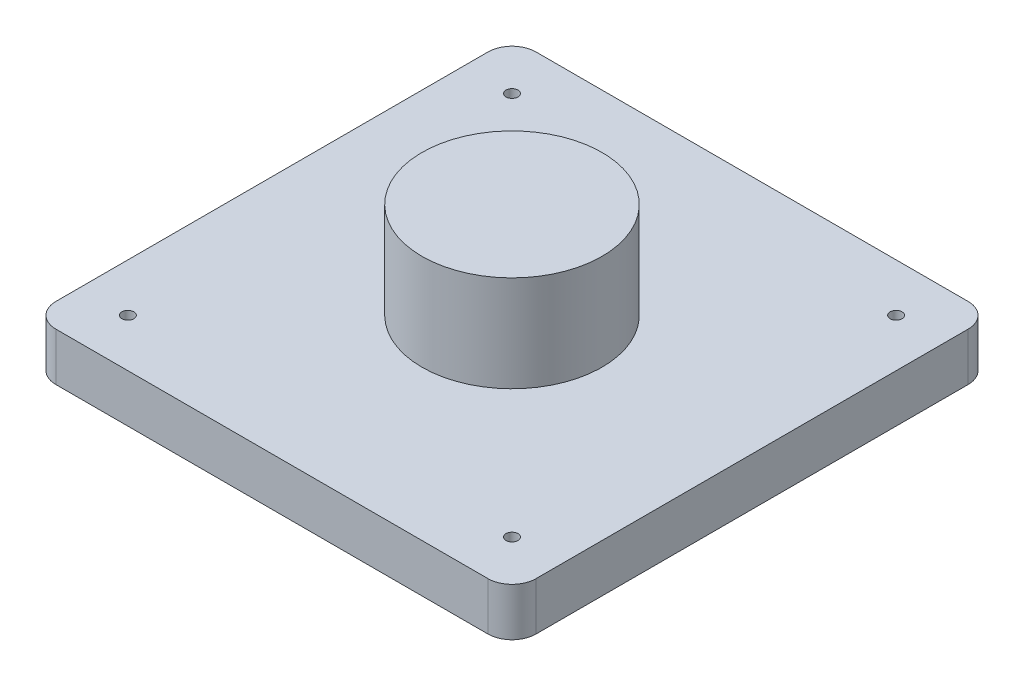
ISO-10303-21;
HEADER;
FILE_DESCRIPTION(('STEP AP214'),'2;1');
FILE_NAME('part.step','',(''),(''),'','','');
FILE_SCHEMA(('AUTOMOTIVE_DESIGN { 1 0 10303 214 1 1 1 1 }'));
ENDSEC;
DATA;
#1=APPLICATION_CONTEXT('core data for automotive mechanical design processes');
#2=APPLICATION_PROTOCOL_DEFINITION('international standard','automotive_design',2000,#1);
#3=PRODUCT_CONTEXT('',#1,'mechanical');
#4=PRODUCT('Part','Part','',(#3));
#5=PRODUCT_RELATED_PRODUCT_CATEGORY('part','',(#4));
#6=PRODUCT_DEFINITION_FORMATION('','',#4);
#7=PRODUCT_DEFINITION_CONTEXT('part definition',#1,'design');
#8=PRODUCT_DEFINITION('design','',#6,#7);
#9=PRODUCT_DEFINITION_SHAPE('','',#8);
#10=(LENGTH_UNIT() NAMED_UNIT(*) SI_UNIT(.MILLI.,.METRE.));
#11=(NAMED_UNIT(*) PLANE_ANGLE_UNIT() SI_UNIT($,.RADIAN.));
#12=(NAMED_UNIT(*) SI_UNIT($,.STERADIAN.) SOLID_ANGLE_UNIT());
#13=UNCERTAINTY_MEASURE_WITH_UNIT(LENGTH_MEASURE(1.E-05),#10,'distance_accuracy_value','');
#14=(GEOMETRIC_REPRESENTATION_CONTEXT(3) GLOBAL_UNCERTAINTY_ASSIGNED_CONTEXT((#13)) GLOBAL_UNIT_ASSIGNED_CONTEXT((#10,
#11,#12)) REPRESENTATION_CONTEXT('',''));
#15=CARTESIAN_POINT('',(0.,0.,0.));
#16=DIRECTION('',(0.,0.,1.));
#17=DIRECTION('',(1.,0.,0.));
#18=AXIS2_PLACEMENT_3D('',#15,#16,#17);
#19=CARTESIAN_POINT('',(-90.,20.,90.));
#20=DIRECTION('',(0.,-1.,0.));
#21=DIRECTION('',(0.,0.,-1.));
#22=AXIS2_PLACEMENT_3D('',#19,#20,#21);
#23=CYLINDRICAL_SURFACE('',#22,9.99999999999999);
#24=CARTESIAN_POINT('',(-90.,0.,90.));
#25=DIRECTION('',(0.,1.,0.));
#26=DIRECTION('',(0.,0.,-1.));
#27=AXIS2_PLACEMENT_3D('',#24,#25,#26);
#28=CIRCLE('',#27,9.99999999999999);
#29=CARTESIAN_POINT('',(-100.,0.,90.));
#30=VERTEX_POINT('',#29);
#31=CARTESIAN_POINT('',(-90.,0.,100.));
#32=VERTEX_POINT('',#31);
#33=EDGE_CURVE('E146',#30,#32,#28,.T.);
#34=ORIENTED_EDGE('',*,*,#33,.T.);
#35=DIRECTION('',(0.,-1.,0.));
#36=VECTOR('',#35,1.);
#37=CARTESIAN_POINT('',(-90.,20.,100.));
#38=LINE('',#37,#36);
#39=CARTESIAN_POINT('',(-90.,20.,100.));
#40=VERTEX_POINT('',#39);
#41=EDGE_CURVE('E46',#40,#32,#38,.T.);
#42=ORIENTED_EDGE('',*,*,#41,.F.);
#43=CARTESIAN_POINT('',(-90.,20.,90.));
#44=DIRECTION('',(0.,1.,0.));
#45=DIRECTION('',(0.,0.,-1.));
#46=AXIS2_PLACEMENT_3D('',#43,#44,#45);
#47=CIRCLE('',#46,9.99999999999999);
#48=CARTESIAN_POINT('',(-100.,20.,90.));
#49=VERTEX_POINT('',#48);
#50=EDGE_CURVE('E169',#49,#40,#47,.T.);
#51=ORIENTED_EDGE('',*,*,#50,.F.);
#52=DIRECTION('',(0.,-1.,0.));
#53=VECTOR('',#52,1.);
#54=CARTESIAN_POINT('',(-100.,20.,90.));
#55=LINE('',#54,#53);
#56=EDGE_CURVE('E142',#49,#30,#55,.T.);
#57=ORIENTED_EDGE('',*,*,#56,.T.);
#58=EDGE_LOOP('',(#34,#42,#51,#57));
#59=FACE_BOUND('',#58,.T.);
#60=ADVANCED_FACE('F43',(#59),#23,.T.);
#61=CARTESIAN_POINT('',(-90.,20.,100.));
#62=DIRECTION('',(0.,0.,-1.));
#63=DIRECTION('',(-1.,0.,0.));
#64=AXIS2_PLACEMENT_3D('',#61,#62,#63);
#65=PLANE('',#64);
#66=DIRECTION('',(1.,0.,0.));
#67=VECTOR('',#66,1.);
#68=CARTESIAN_POINT('',(-90.,0.,100.));
#69=LINE('',#68,#67);
#70=CARTESIAN_POINT('',(90.,0.,100.));
#71=VERTEX_POINT('',#70);
#72=EDGE_CURVE('E150',#32,#71,#69,.T.);
#73=ORIENTED_EDGE('',*,*,#72,.T.);
#74=DIRECTION('',(0.,-1.,0.));
#75=VECTOR('',#74,1.);
#76=CARTESIAN_POINT('',(90.,20.,100.));
#77=LINE('',#76,#75);
#78=CARTESIAN_POINT('',(90.,20.,100.));
#79=VERTEX_POINT('',#78);
#80=EDGE_CURVE('E183',#79,#71,#77,.T.);
#81=ORIENTED_EDGE('',*,*,#80,.F.);
#82=DIRECTION('',(1.,0.,0.));
#83=VECTOR('',#82,1.);
#84=CARTESIAN_POINT('',(-90.,20.,100.));
#85=LINE('',#84,#83);
#86=EDGE_CURVE('E105',#40,#79,#85,.T.);
#87=ORIENTED_EDGE('',*,*,#86,.F.);
#88=ORIENTED_EDGE('',*,*,#41,.T.);
#89=EDGE_LOOP('',(#73,#81,#87,#88));
#90=FACE_BOUND('',#89,.T.);
#91=ADVANCED_FACE('F191',(#90),#65,.F.);
#92=CARTESIAN_POINT('',(90.,20.,90.));
#93=DIRECTION('',(0.,-1.,0.));
#94=DIRECTION('',(0.,0.,-1.));
#95=AXIS2_PLACEMENT_3D('',#92,#93,#94);
#96=CYLINDRICAL_SURFACE('',#95,10.);
#97=CARTESIAN_POINT('',(90.,0.,90.));
#98=DIRECTION('',(0.,1.,0.));
#99=DIRECTION('',(0.,0.,1.));
#100=AXIS2_PLACEMENT_3D('',#97,#98,#99);
#101=CIRCLE('',#100,10.);
#102=CARTESIAN_POINT('',(100.,0.,90.));
#103=VERTEX_POINT('',#102);
#104=EDGE_CURVE('E154',#71,#103,#101,.T.);
#105=ORIENTED_EDGE('',*,*,#104,.T.);
#106=DIRECTION('',(0.,-1.,0.));
#107=VECTOR('',#106,1.);
#108=CARTESIAN_POINT('',(100.,20.,90.));
#109=LINE('',#108,#107);
#110=CARTESIAN_POINT('',(100.,20.,90.));
#111=VERTEX_POINT('',#110);
#112=EDGE_CURVE('E180',#111,#103,#109,.T.);
#113=ORIENTED_EDGE('',*,*,#112,.F.);
#114=CARTESIAN_POINT('',(90.,20.,90.));
#115=DIRECTION('',(0.,1.,0.));
#116=DIRECTION('',(0.,0.,1.));
#117=AXIS2_PLACEMENT_3D('',#114,#115,#116);
#118=CIRCLE('',#117,10.);
#119=EDGE_CURVE('E207',#79,#111,#118,.T.);
#120=ORIENTED_EDGE('',*,*,#119,.F.);
#121=ORIENTED_EDGE('',*,*,#80,.T.);
#122=EDGE_LOOP('',(#105,#113,#120,#121));
#123=FACE_BOUND('',#122,.T.);
#124=ADVANCED_FACE('F200',(#123),#96,.T.);
#125=CARTESIAN_POINT('',(100.,20.,90.));
#126=DIRECTION('',(-1.,0.,0.));
#127=DIRECTION('',(0.,0.,1.));
#128=AXIS2_PLACEMENT_3D('',#125,#126,#127);
#129=PLANE('',#128);
#130=DIRECTION('',(0.,0.,-1.));
#131=VECTOR('',#130,1.);
#132=CARTESIAN_POINT('',(100.,0.,90.));
#133=LINE('',#132,#131);
#134=CARTESIAN_POINT('',(100.,0.,-90.));
#135=VERTEX_POINT('',#134);
#136=EDGE_CURVE('E157',#103,#135,#133,.T.);
#137=ORIENTED_EDGE('',*,*,#136,.T.);
#138=DIRECTION('',(0.,-1.,0.));
#139=VECTOR('',#138,1.);
#140=CARTESIAN_POINT('',(100.,20.,-90.));
#141=LINE('',#140,#139);
#142=CARTESIAN_POINT('',(100.,20.,-90.));
#143=VERTEX_POINT('',#142);
#144=EDGE_CURVE('E176',#143,#135,#141,.T.);
#145=ORIENTED_EDGE('',*,*,#144,.F.);
#146=DIRECTION('',(0.,0.,-1.));
#147=VECTOR('',#146,1.);
#148=CARTESIAN_POINT('',(100.,20.,90.));
#149=LINE('',#148,#147);
#150=EDGE_CURVE('E205',#111,#143,#149,.T.);
#151=ORIENTED_EDGE('',*,*,#150,.F.);
#152=ORIENTED_EDGE('',*,*,#112,.T.);
#153=EDGE_LOOP('',(#137,#145,#151,#152));
#154=FACE_BOUND('',#153,.T.);
#155=ADVANCED_FACE('F203',(#154),#129,.F.);
#156=CARTESIAN_POINT('',(90.,20.,-90.));
#157=DIRECTION('',(0.,-1.,0.));
#158=DIRECTION('',(0.,0.,-1.));
#159=AXIS2_PLACEMENT_3D('',#156,#157,#158);
#160=CYLINDRICAL_SURFACE('',#159,10.);
#161=CARTESIAN_POINT('',(90.,0.,-90.));
#162=DIRECTION('',(0.,1.,0.));
#163=DIRECTION('',(0.,0.,-1.));
#164=AXIS2_PLACEMENT_3D('',#161,#162,#163);
#165=CIRCLE('',#164,10.);
#166=CARTESIAN_POINT('',(90.,0.,-100.));
#167=VERTEX_POINT('',#166);
#168=EDGE_CURVE('E160',#135,#167,#165,.T.);
#169=ORIENTED_EDGE('',*,*,#168,.T.);
#170=DIRECTION('',(0.,-1.,0.));
#171=VECTOR('',#170,1.);
#172=CARTESIAN_POINT('',(90.,20.,-100.));
#173=LINE('',#172,#171);
#174=CARTESIAN_POINT('',(90.,20.,-100.));
#175=VERTEX_POINT('',#174);
#176=EDGE_CURVE('E135',#175,#167,#173,.T.);
#177=ORIENTED_EDGE('',*,*,#176,.F.);
#178=CARTESIAN_POINT('',(90.,20.,-90.));
#179=DIRECTION('',(0.,1.,0.));
#180=DIRECTION('',(0.,0.,-1.));
#181=AXIS2_PLACEMENT_3D('',#178,#179,#180);
#182=CIRCLE('',#181,10.);
#183=EDGE_CURVE('E124',#143,#175,#182,.T.);
#184=ORIENTED_EDGE('',*,*,#183,.F.);
#185=ORIENTED_EDGE('',*,*,#144,.T.);
#186=EDGE_LOOP('',(#169,#177,#184,#185));
#187=FACE_BOUND('',#186,.T.);
#188=ADVANCED_FACE('F297',(#187),#160,.T.);
#189=CARTESIAN_POINT('',(-90.,20.,-100.));
#190=DIRECTION('',(0.,0.,1.));
#191=DIRECTION('',(1.,0.,0.));
#192=AXIS2_PLACEMENT_3D('',#189,#190,#191);
#193=PLANE('',#192);
#194=DIRECTION('',(-1.,0.,0.));
#195=VECTOR('',#194,1.);
#196=CARTESIAN_POINT('',(-90.,0.,-100.));
#197=LINE('',#196,#195);
#198=CARTESIAN_POINT('',(-90.,0.,-100.));
#199=VERTEX_POINT('',#198);
#200=EDGE_CURVE('E133',#167,#199,#197,.T.);
#201=ORIENTED_EDGE('',*,*,#200,.T.);
#202=DIRECTION('',(0.,-1.,0.));
#203=VECTOR('',#202,1.);
#204=CARTESIAN_POINT('',(-90.,20.,-100.));
#205=LINE('',#204,#203);
#206=CARTESIAN_POINT('',(-90.,20.,-100.));
#207=VERTEX_POINT('',#206);
#208=EDGE_CURVE('E130',#207,#199,#205,.T.);
#209=ORIENTED_EDGE('',*,*,#208,.F.);
#210=DIRECTION('',(-1.,0.,0.));
#211=VECTOR('',#210,1.);
#212=CARTESIAN_POINT('',(-90.,20.,-100.));
#213=LINE('',#212,#211);
#214=EDGE_CURVE('E118',#175,#207,#213,.T.);
#215=ORIENTED_EDGE('',*,*,#214,.F.);
#216=ORIENTED_EDGE('',*,*,#176,.T.);
#217=EDGE_LOOP('',(#201,#209,#215,#216));
#218=FACE_BOUND('',#217,.T.);
#219=ADVANCED_FACE('F131',(#218),#193,.F.);
#220=CARTESIAN_POINT('',(-90.,20.,-90.));
#221=DIRECTION('',(0.,-1.,0.));
#222=DIRECTION('',(0.,0.,-1.));
#223=AXIS2_PLACEMENT_3D('',#220,#221,#222);
#224=CYLINDRICAL_SURFACE('',#223,9.99999999999999);
#225=CARTESIAN_POINT('',(-90.,0.,-90.));
#226=DIRECTION('',(0.,1.,0.));
#227=DIRECTION('',(0.,0.,-1.));
#228=AXIS2_PLACEMENT_3D('',#225,#226,#227);
#229=CIRCLE('',#228,9.99999999999999);
#230=CARTESIAN_POINT('',(-100.,0.,-90.));
#231=VERTEX_POINT('',#230);
#232=EDGE_CURVE('E90',#199,#231,#229,.T.);
#233=ORIENTED_EDGE('',*,*,#232,.T.);
#234=DIRECTION('',(0.,-1.,0.));
#235=VECTOR('',#234,1.);
#236=CARTESIAN_POINT('',(-100.,20.,-90.));
#237=LINE('',#236,#235);
#238=CARTESIAN_POINT('',(-100.,20.,-90.));
#239=VERTEX_POINT('',#238);
#240=EDGE_CURVE('E136',#239,#231,#237,.T.);
#241=ORIENTED_EDGE('',*,*,#240,.F.);
#242=CARTESIAN_POINT('',(-90.,20.,-90.));
#243=DIRECTION('',(0.,1.,0.));
#244=DIRECTION('',(0.,0.,-1.));
#245=AXIS2_PLACEMENT_3D('',#242,#243,#244);
#246=CIRCLE('',#245,9.99999999999999);
#247=EDGE_CURVE('E122',#207,#239,#246,.T.);
#248=ORIENTED_EDGE('',*,*,#247,.F.);
#249=ORIENTED_EDGE('',*,*,#208,.T.);
#250=EDGE_LOOP('',(#233,#241,#248,#249));
#251=FACE_BOUND('',#250,.T.);
#252=ADVANCED_FACE('F138',(#251),#224,.T.);
#253=CARTESIAN_POINT('',(-100.,20.,90.));
#254=DIRECTION('',(1.,0.,0.));
#255=DIRECTION('',(0.,0.,-1.));
#256=AXIS2_PLACEMENT_3D('',#253,#254,#255);
#257=PLANE('',#256);
#258=DIRECTION('',(0.,0.,1.));
#259=VECTOR('',#258,1.);
#260=CARTESIAN_POINT('',(-100.,0.,90.));
#261=LINE('',#260,#259);
#262=EDGE_CURVE('E96',#231,#30,#261,.T.);
#263=ORIENTED_EDGE('',*,*,#262,.T.);
#264=ORIENTED_EDGE('',*,*,#56,.F.);
#265=DIRECTION('',(0.,0.,1.));
#266=VECTOR('',#265,1.);
#267=CARTESIAN_POINT('',(-100.,20.,90.));
#268=LINE('',#267,#266);
#269=EDGE_CURVE('E61',#239,#49,#268,.T.);
#270=ORIENTED_EDGE('',*,*,#269,.F.);
#271=ORIENTED_EDGE('',*,*,#240,.T.);
#272=EDGE_LOOP('',(#263,#264,#270,#271));
#273=FACE_BOUND('',#272,.T.);
#274=ADVANCED_FACE('F265',(#273),#257,.F.);
#275=CARTESIAN_POINT('',(-90.,20.,90.));
#276=DIRECTION('',(0.,-1.,0.));
#277=DIRECTION('',(0.,0.,-1.));
#278=AXIS2_PLACEMENT_3D('',#275,#276,#277);
#279=PLANE('',#278);
#280=CARTESIAN_POINT('',(-80.,20.,80.));
#281=DIRECTION('',(0.,1.,0.));
#282=DIRECTION('',(0.,0.,1.));
#283=AXIS2_PLACEMENT_3D('',#280,#281,#282);
#284=CIRCLE('',#283,2.50000000000001);
#285=CARTESIAN_POINT('',(-80.,20.,82.5));
#286=VERTEX_POINT('',#285);
#287=EDGE_CURVE('E229',#286,#286,#284,.T.);
#288=ORIENTED_EDGE('',*,*,#287,.F.);
#289=EDGE_LOOP('',(#288));
#290=FACE_BOUND('',#289,.T.);
#291=CARTESIAN_POINT('',(80.,20.,80.));
#292=DIRECTION('',(0.,1.,0.));
#293=DIRECTION('',(0.,0.,1.));
#294=AXIS2_PLACEMENT_3D('',#291,#292,#293);
#295=CIRCLE('',#294,2.5);
#296=CARTESIAN_POINT('',(80.,20.,82.5));
#297=VERTEX_POINT('',#296);
#298=EDGE_CURVE('E237',#297,#297,#295,.T.);
#299=ORIENTED_EDGE('',*,*,#298,.F.);
#300=EDGE_LOOP('',(#299));
#301=FACE_BOUND('',#300,.T.);
#302=CARTESIAN_POINT('',(80.,20.,-80.));
#303=DIRECTION('',(0.,1.,0.));
#304=DIRECTION('',(0.,0.,1.));
#305=AXIS2_PLACEMENT_3D('',#302,#303,#304);
#306=CIRCLE('',#305,2.5);
#307=CARTESIAN_POINT('',(80.,20.,-77.5));
#308=VERTEX_POINT('',#307);
#309=EDGE_CURVE('E245',#308,#308,#306,.T.);
#310=ORIENTED_EDGE('',*,*,#309,.F.);
#311=EDGE_LOOP('',(#310));
#312=FACE_BOUND('',#311,.T.);
#313=CARTESIAN_POINT('',(-80.,20.,-80.));
#314=DIRECTION('',(0.,1.,0.));
#315=DIRECTION('',(0.,0.,1.));
#316=AXIS2_PLACEMENT_3D('',#313,#314,#315);
#317=CIRCLE('',#316,2.50000000000001);
#318=CARTESIAN_POINT('',(-80.,20.,-77.5));
#319=VERTEX_POINT('',#318);
#320=EDGE_CURVE('E220',#319,#319,#317,.T.);
#321=ORIENTED_EDGE('',*,*,#320,.F.);
#322=EDGE_LOOP('',(#321));
#323=FACE_BOUND('',#322,.T.);
#324=CARTESIAN_POINT('',(0.,20.,0.));
#325=DIRECTION('',(0.,1.,0.));
#326=DIRECTION('',(0.,0.,1.));
#327=AXIS2_PLACEMENT_3D('',#324,#325,#326);
#328=CIRCLE('',#327,37.5);
#329=CARTESIAN_POINT('',(0.,20.,37.5));
#330=VERTEX_POINT('',#329);
#331=EDGE_CURVE('E11',#330,#330,#328,.T.);
#332=ORIENTED_EDGE('',*,*,#331,.F.);
#333=EDGE_LOOP('',(#332));
#334=FACE_BOUND('',#333,.T.);
#335=ORIENTED_EDGE('',*,*,#50,.T.);
#336=ORIENTED_EDGE('',*,*,#86,.T.);
#337=ORIENTED_EDGE('',*,*,#119,.T.);
#338=ORIENTED_EDGE('',*,*,#150,.T.);
#339=ORIENTED_EDGE('',*,*,#183,.T.);
#340=ORIENTED_EDGE('',*,*,#214,.T.);
#341=ORIENTED_EDGE('',*,*,#247,.T.);
#342=ORIENTED_EDGE('',*,*,#269,.T.);
#343=EDGE_LOOP('',(#335,#336,#337,#338,#339,#340,#341,#342));
#344=FACE_BOUND('',#343,.T.);
#345=ADVANCED_FACE('F120',(#290,#301,#312,#323,#334,#344),#279,.F.);
#346=CARTESIAN_POINT('',(-90.,0.,90.));
#347=DIRECTION('',(0.,-1.,0.));
#348=DIRECTION('',(0.,0.,-1.));
#349=AXIS2_PLACEMENT_3D('',#346,#347,#348);
#350=PLANE('',#349);
#351=CARTESIAN_POINT('',(-80.,0.,80.));
#352=DIRECTION('',(0.,-1.,0.));
#353=DIRECTION('',(0.,0.,-1.));
#354=AXIS2_PLACEMENT_3D('',#351,#352,#353);
#355=CIRCLE('',#354,2.50000000000001);
#356=CARTESIAN_POINT('',(-80.,0.,77.5));
#357=VERTEX_POINT('',#356);
#358=EDGE_CURVE('E233',#357,#357,#355,.F.);
#359=ORIENTED_EDGE('',*,*,#358,.T.);
#360=EDGE_LOOP('',(#359));
#361=FACE_BOUND('',#360,.T.);
#362=CARTESIAN_POINT('',(80.,0.,80.));
#363=DIRECTION('',(0.,-1.,0.));
#364=DIRECTION('',(0.,0.,-1.));
#365=AXIS2_PLACEMENT_3D('',#362,#363,#364);
#366=CIRCLE('',#365,2.5);
#367=CARTESIAN_POINT('',(80.,0.,77.5));
#368=VERTEX_POINT('',#367);
#369=EDGE_CURVE('E241',#368,#368,#366,.F.);
#370=ORIENTED_EDGE('',*,*,#369,.T.);
#371=EDGE_LOOP('',(#370));
#372=FACE_BOUND('',#371,.T.);
#373=CARTESIAN_POINT('',(80.,0.,-80.));
#374=DIRECTION('',(0.,-1.,0.));
#375=DIRECTION('',(0.,0.,-1.));
#376=AXIS2_PLACEMENT_3D('',#373,#374,#375);
#377=CIRCLE('',#376,2.5);
#378=CARTESIAN_POINT('',(80.,0.,-82.5));
#379=VERTEX_POINT('',#378);
#380=EDGE_CURVE('E225',#379,#379,#377,.F.);
#381=ORIENTED_EDGE('',*,*,#380,.T.);
#382=EDGE_LOOP('',(#381));
#383=FACE_BOUND('',#382,.T.);
#384=CARTESIAN_POINT('',(-80.,0.,-80.));
#385=DIRECTION('',(0.,-1.,0.));
#386=DIRECTION('',(0.,0.,-1.));
#387=AXIS2_PLACEMENT_3D('',#384,#385,#386);
#388=CIRCLE('',#387,2.50000000000001);
#389=CARTESIAN_POINT('',(-80.,0.,-82.5));
#390=VERTEX_POINT('',#389);
#391=EDGE_CURVE('E221',#390,#390,#388,.F.);
#392=ORIENTED_EDGE('',*,*,#391,.T.);
#393=EDGE_LOOP('',(#392));
#394=FACE_BOUND('',#393,.T.);
#395=ORIENTED_EDGE('',*,*,#33,.F.);
#396=ORIENTED_EDGE('',*,*,#262,.F.);
#397=ORIENTED_EDGE('',*,*,#232,.F.);
#398=ORIENTED_EDGE('',*,*,#200,.F.);
#399=ORIENTED_EDGE('',*,*,#168,.F.);
#400=ORIENTED_EDGE('',*,*,#136,.F.);
#401=ORIENTED_EDGE('',*,*,#104,.F.);
#402=ORIENTED_EDGE('',*,*,#72,.F.);
#403=EDGE_LOOP('',(#395,#396,#397,#398,#399,#400,#401,#402));
#404=FACE_BOUND('',#403,.T.);
#405=ADVANCED_FACE('F196',(#361,#372,#383,#394,#404),#350,.T.);
#406=CARTESIAN_POINT('',(0.,60.,0.));
#407=DIRECTION('',(0.,-1.,0.));
#408=DIRECTION('',(0.,0.,-1.));
#409=AXIS2_PLACEMENT_3D('',#406,#407,#408);
#410=CYLINDRICAL_SURFACE('',#409,37.5);
#411=CARTESIAN_POINT('',(0.,60.,0.));
#412=DIRECTION('',(0.,1.,0.));
#413=DIRECTION('',(0.,0.,1.));
#414=AXIS2_PLACEMENT_3D('',#411,#412,#413);
#415=CIRCLE('',#414,37.5);
#416=CARTESIAN_POINT('',(0.,60.,37.5));
#417=VERTEX_POINT('',#416);
#418=EDGE_CURVE('E151',#417,#417,#415,.T.);
#419=ORIENTED_EDGE('',*,*,#418,.F.);
#420=EDGE_LOOP('',(#419));
#421=FACE_BOUND('',#420,.T.);
#422=ORIENTED_EDGE('',*,*,#331,.T.);
#423=EDGE_LOOP('',(#422));
#424=FACE_BOUND('',#423,.T.);
#425=ADVANCED_FACE('F272',(#421,#424),#410,.T.);
#426=CARTESIAN_POINT('',(0.,60.,0.));
#427=DIRECTION('',(0.,1.,0.));
#428=DIRECTION('',(0.,0.,1.));
#429=AXIS2_PLACEMENT_3D('',#426,#427,#428);
#430=PLANE('',#429);
#431=ORIENTED_EDGE('',*,*,#418,.T.);
#432=EDGE_LOOP('',(#431));
#433=FACE_BOUND('',#432,.T.);
#434=ADVANCED_FACE('F274',(#433),#430,.T.);
#435=CARTESIAN_POINT('',(-80.,-0.001000000000001,-80.));
#436=DIRECTION('',(0.,1.,0.));
#437=DIRECTION('',(0.,0.,1.));
#438=AXIS2_PLACEMENT_3D('',#435,#436,#437);
#439=CYLINDRICAL_SURFACE('',#438,2.50000000000001);
#440=ORIENTED_EDGE('',*,*,#391,.F.);
#441=EDGE_LOOP('',(#440));
#442=FACE_BOUND('',#441,.T.);
#443=ORIENTED_EDGE('',*,*,#320,.T.);
#444=EDGE_LOOP('',(#443));
#445=FACE_BOUND('',#444,.T.);
#446=ADVANCED_FACE('F259',(#442,#445),#439,.F.);
#447=CARTESIAN_POINT('',(80.,-0.001000000000001,-80.));
#448=DIRECTION('',(0.,1.,0.));
#449=DIRECTION('',(0.,0.,1.));
#450=AXIS2_PLACEMENT_3D('',#447,#448,#449);
#451=CYLINDRICAL_SURFACE('',#450,2.5);
#452=ORIENTED_EDGE('',*,*,#380,.F.);
#453=EDGE_LOOP('',(#452));
#454=FACE_BOUND('',#453,.T.);
#455=ORIENTED_EDGE('',*,*,#309,.T.);
#456=EDGE_LOOP('',(#455));
#457=FACE_BOUND('',#456,.T.);
#458=ADVANCED_FACE('F255',(#454,#457),#451,.F.);
#459=CARTESIAN_POINT('',(80.,-0.001000000000001,80.));
#460=DIRECTION('',(0.,1.,0.));
#461=DIRECTION('',(0.,0.,1.));
#462=AXIS2_PLACEMENT_3D('',#459,#460,#461);
#463=CYLINDRICAL_SURFACE('',#462,2.5);
#464=ORIENTED_EDGE('',*,*,#369,.F.);
#465=EDGE_LOOP('',(#464));
#466=FACE_BOUND('',#465,.T.);
#467=ORIENTED_EDGE('',*,*,#298,.T.);
#468=EDGE_LOOP('',(#467));
#469=FACE_BOUND('',#468,.T.);
#470=ADVANCED_FACE('F258',(#466,#469),#463,.F.);
#471=CARTESIAN_POINT('',(-80.,-0.001000000000001,80.));
#472=DIRECTION('',(0.,1.,0.));
#473=DIRECTION('',(0.,0.,1.));
#474=AXIS2_PLACEMENT_3D('',#471,#472,#473);
#475=CYLINDRICAL_SURFACE('',#474,2.50000000000001);
#476=ORIENTED_EDGE('',*,*,#358,.F.);
#477=EDGE_LOOP('',(#476));
#478=FACE_BOUND('',#477,.T.);
#479=ORIENTED_EDGE('',*,*,#287,.T.);
#480=EDGE_LOOP('',(#479));
#481=FACE_BOUND('',#480,.T.);
#482=ADVANCED_FACE('F348',(#478,#481),#475,.F.);
#483=CLOSED_SHELL('',(#60,#91,#124,#155,#188,#219,#252,#274,#345,#405,#425,#434,#446,#458,#470,#482));
#484=MANIFOLD_SOLID_BREP('B2',#483);
#485=ADVANCED_BREP_SHAPE_REPRESENTATION('',(#18,#484),#14);
#486=SHAPE_DEFINITION_REPRESENTATION(#9,#485);
ENDSEC;
END-ISO-10303-21;
